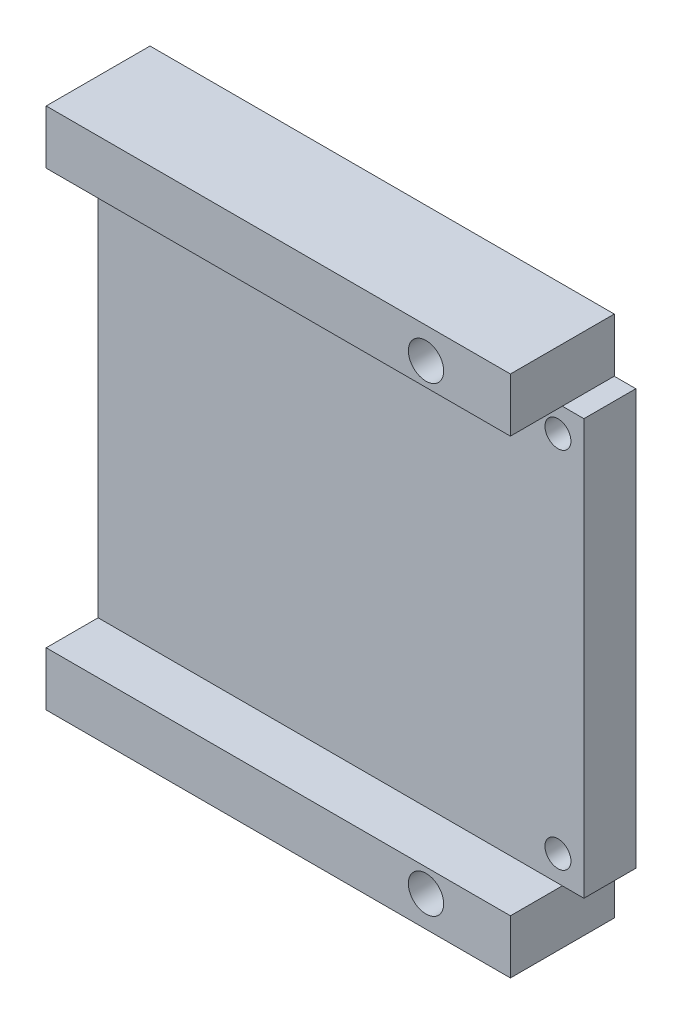
ISO-10303-21;
HEADER;
FILE_DESCRIPTION(('STEP AP214'),'2;1');
FILE_NAME('part.step','',(''),(''),'','','');
FILE_SCHEMA(('AUTOMOTIVE_DESIGN { 1 0 10303 214 1 1 1 1 }'));
ENDSEC;
DATA;
#1=APPLICATION_CONTEXT('core data for automotive mechanical design processes');
#2=APPLICATION_PROTOCOL_DEFINITION('international standard','automotive_design',2000,#1);
#3=PRODUCT_CONTEXT('',#1,'mechanical');
#4=PRODUCT('Part','Part','',(#3));
#5=PRODUCT_RELATED_PRODUCT_CATEGORY('part','',(#4));
#6=PRODUCT_DEFINITION_FORMATION('','',#4);
#7=PRODUCT_DEFINITION_CONTEXT('part definition',#1,'design');
#8=PRODUCT_DEFINITION('design','',#6,#7);
#9=PRODUCT_DEFINITION_SHAPE('','',#8);
#10=(LENGTH_UNIT() NAMED_UNIT(*) SI_UNIT(.MILLI.,.METRE.));
#11=(NAMED_UNIT(*) PLANE_ANGLE_UNIT() SI_UNIT($,.RADIAN.));
#12=(NAMED_UNIT(*) SI_UNIT($,.STERADIAN.) SOLID_ANGLE_UNIT());
#13=UNCERTAINTY_MEASURE_WITH_UNIT(LENGTH_MEASURE(1.E-05),#10,'distance_accuracy_value','');
#14=(GEOMETRIC_REPRESENTATION_CONTEXT(3) GLOBAL_UNCERTAINTY_ASSIGNED_CONTEXT((#13)) GLOBAL_UNIT_ASSIGNED_CONTEXT((#10,
#11,#12)) REPRESENTATION_CONTEXT('',''));
#15=CARTESIAN_POINT('',(0.,0.,0.));
#16=DIRECTION('',(0.,0.,1.));
#17=DIRECTION('',(1.,0.,0.));
#18=AXIS2_PLACEMENT_3D('',#15,#16,#17);
#19=CARTESIAN_POINT('',(0.,0.,5.));
#20=DIRECTION('',(0.,0.,-1.));
#21=DIRECTION('',(-1.,0.,0.));
#22=AXIS2_PLACEMENT_3D('',#19,#20,#21);
#23=PLANE('',#22);
#24=CARTESIAN_POINT('',(129.540225419175,91.2831739798293,5.));
#25=DIRECTION('',(0.,0.,1.));
#26=DIRECTION('',(1.,0.,0.));
#27=AXIS2_PLACEMENT_3D('',#24,#25,#26);
#28=CIRCLE('',#27,1.25000000000001);
#29=CARTESIAN_POINT('',(130.790225419175,91.2831739798293,5.));
#30=VERTEX_POINT('',#29);
#31=EDGE_CURVE('E203',#30,#30,#28,.T.);
#32=ORIENTED_EDGE('',*,*,#31,.F.);
#33=EDGE_LOOP('',(#32));
#34=FACE_BOUND('',#33,.T.);
#35=CARTESIAN_POINT('',(129.540225419175,56.2544582419486,5.));
#36=DIRECTION('',(0.,0.,1.));
#37=DIRECTION('',(1.,0.,0.));
#38=AXIS2_PLACEMENT_3D('',#35,#36,#37);
#39=CIRCLE('',#38,1.25032979393516);
#40=CARTESIAN_POINT('',(130.790555213111,56.2544582419486,5.));
#41=VERTEX_POINT('',#40);
#42=EDGE_CURVE('E195',#41,#41,#39,.T.);
#43=ORIENTED_EDGE('',*,*,#42,.F.);
#44=EDGE_LOOP('',(#43));
#45=FACE_BOUND('',#44,.T.);
#46=DIRECTION('',(-1.,0.,0.));
#47=VECTOR('',#46,1.);
#48=CARTESIAN_POINT('',(129.963224991925,53.7831739798293,5.));
#49=LINE('',#48,#47);
#50=CARTESIAN_POINT('',(129.963224991925,53.7831739798293,5.));
#51=VERTEX_POINT('',#50);
#52=CARTESIAN_POINT('',(85.253810187031,53.7831739798293,5.));
#53=VERTEX_POINT('',#52);
#54=EDGE_CURVE('E146',#51,#53,#49,.T.);
#55=ORIENTED_EDGE('',*,*,#54,.F.);
#56=DIRECTION('',(1.,0.,0.));
#57=VECTOR('',#56,1.);
#58=CARTESIAN_POINT('',(132.040225419175,53.7831739798293,5.));
#59=LINE('',#58,#57);
#60=CARTESIAN_POINT('',(132.040225419175,53.7831739798293,5.));
#61=VERTEX_POINT('',#60);
#62=EDGE_CURVE('E221',#51,#61,#59,.T.);
#63=ORIENTED_EDGE('',*,*,#62,.T.);
#64=DIRECTION('',(0.,1.,0.));
#65=VECTOR('',#64,1.);
#66=CARTESIAN_POINT('',(132.040225419175,93.7831739798293,5.));
#67=LINE('',#66,#65);
#68=CARTESIAN_POINT('',(132.040225419175,93.7831739798293,5.));
#69=VERTEX_POINT('',#68);
#70=EDGE_CURVE('E211',#61,#69,#67,.T.);
#71=ORIENTED_EDGE('',*,*,#70,.T.);
#72=DIRECTION('',(-0.999998956895983,0.00144437077845255,0.));
#73=VECTOR('',#72,1.);
#74=CARTESIAN_POINT('',(129.963224991925,93.7861739416825,5.));
#75=LINE('',#74,#73);
#76=CARTESIAN_POINT('',(129.963224991925,93.7861739416825,5.));
#77=VERTEX_POINT('',#76);
#78=EDGE_CURVE('E215',#69,#77,#75,.T.);
#79=ORIENTED_EDGE('',*,*,#78,.T.);
#80=DIRECTION('',(0.999999997748855,6.709910786271E-05,0.));
#81=VECTOR('',#80,1.);
#82=CARTESIAN_POINT('',(129.963224991925,93.7861739416825,5.));
#83=LINE('',#82,#81);
#84=CARTESIAN_POINT('',(85.253810187031,93.7831739798293,5.));
#85=VERTEX_POINT('',#84);
#86=EDGE_CURVE('E60',#85,#77,#83,.T.);
#87=ORIENTED_EDGE('',*,*,#86,.F.);
#88=DIRECTION('',(0.,-1.,0.));
#89=VECTOR('',#88,1.);
#90=CARTESIAN_POINT('',(85.253810187031,48.5941739798295,5.));
#91=LINE('',#90,#89);
#92=EDGE_CURVE('E55',#85,#53,#91,.T.);
#93=ORIENTED_EDGE('',*,*,#92,.T.);
#94=EDGE_LOOP('',(#55,#63,#71,#79,#87,#93));
#95=FACE_BOUND('',#94,.T.);
#96=ADVANCED_FACE('F39',(#34,#45,#95),#23,.F.);
#97=CARTESIAN_POINT('',(0.,0.,0.));
#98=DIRECTION('',(0.,0.,-1.));
#99=DIRECTION('',(-1.,0.,0.));
#100=AXIS2_PLACEMENT_3D('',#97,#98,#99);
#101=PLANE('',#100);
#102=CARTESIAN_POINT('',(121.835225419175,51.5641739798295,0.));
#103=DIRECTION('',(0.,0.,1.));
#104=DIRECTION('',(1.,0.,0.));
#105=AXIS2_PLACEMENT_3D('',#102,#103,#104);
#106=CIRCLE('',#105,1.70000000000001);
#107=CARTESIAN_POINT('',(123.535225419175,51.5641739798295,0.));
#108=VERTEX_POINT('',#107);
#109=EDGE_CURVE('E190',#108,#108,#106,.T.);
#110=ORIENTED_EDGE('',*,*,#109,.T.);
#111=EDGE_LOOP('',(#110));
#112=FACE_BOUND('',#111,.T.);
#113=CARTESIAN_POINT('',(129.540225419175,91.2831739798293,0.));
#114=DIRECTION('',(0.,0.,1.));
#115=DIRECTION('',(1.,0.,0.));
#116=AXIS2_PLACEMENT_3D('',#113,#114,#115);
#117=CIRCLE('',#116,1.25000000000001);
#118=CARTESIAN_POINT('',(130.790225419175,91.2831739798293,0.));
#119=VERTEX_POINT('',#118);
#120=EDGE_CURVE('E199',#119,#119,#117,.T.);
#121=ORIENTED_EDGE('',*,*,#120,.T.);
#122=EDGE_LOOP('',(#121));
#123=FACE_BOUND('',#122,.T.);
#124=DIRECTION('',(0.,1.,0.));
#125=VECTOR('',#124,1.);
#126=CARTESIAN_POINT('',(132.040225419175,93.7831739798293,0.));
#127=LINE('',#126,#125);
#128=CARTESIAN_POINT('',(132.040225419175,53.7831739798293,0.));
#129=VERTEX_POINT('',#128);
#130=CARTESIAN_POINT('',(132.040225419175,93.7831739798293,0.));
#131=VERTEX_POINT('',#130);
#132=EDGE_CURVE('E207',#129,#131,#127,.T.);
#133=ORIENTED_EDGE('',*,*,#132,.F.);
#134=DIRECTION('',(1.,0.,0.));
#135=VECTOR('',#134,1.);
#136=CARTESIAN_POINT('',(132.040225419175,53.7831739798293,0.));
#137=LINE('',#136,#135);
#138=CARTESIAN_POINT('',(129.963224991925,53.7831739798293,0.));
#139=VERTEX_POINT('',#138);
#140=EDGE_CURVE('E216',#139,#129,#137,.T.);
#141=ORIENTED_EDGE('',*,*,#140,.F.);
#142=DIRECTION('',(0.,1.,0.));
#143=VECTOR('',#142,1.);
#144=CARTESIAN_POINT('',(129.963224991925,53.7831739798293,0.));
#145=LINE('',#144,#143);
#146=CARTESIAN_POINT('',(129.963224991925,48.5941739798295,0.));
#147=VERTEX_POINT('',#146);
#148=EDGE_CURVE('E243',#147,#139,#145,.T.);
#149=ORIENTED_EDGE('',*,*,#148,.F.);
#150=DIRECTION('',(1.,0.,0.));
#151=VECTOR('',#150,1.);
#152=CARTESIAN_POINT('',(129.963224991925,48.5941739798295,0.));
#153=LINE('',#152,#151);
#154=CARTESIAN_POINT('',(85.253810187031,48.5941739798295,0.));
#155=VERTEX_POINT('',#154);
#156=EDGE_CURVE('E240',#155,#147,#153,.T.);
#157=ORIENTED_EDGE('',*,*,#156,.F.);
#158=DIRECTION('',(0.,-1.,0.));
#159=VECTOR('',#158,1.);
#160=CARTESIAN_POINT('',(85.253810187031,48.5941739798295,0.));
#161=LINE('',#160,#159);
#162=CARTESIAN_POINT('',(85.253810187031,98.9731739798295,0.));
#163=VERTEX_POINT('',#162);
#164=EDGE_CURVE('E237',#163,#155,#161,.T.);
#165=ORIENTED_EDGE('',*,*,#164,.F.);
#166=DIRECTION('',(-1.,0.,0.));
#167=VECTOR('',#166,1.);
#168=CARTESIAN_POINT('',(85.253810187031,98.9731739798295,0.));
#169=LINE('',#168,#167);
#170=CARTESIAN_POINT('',(129.963224991925,98.9731739798295,0.));
#171=VERTEX_POINT('',#170);
#172=EDGE_CURVE('E234',#171,#163,#169,.T.);
#173=ORIENTED_EDGE('',*,*,#172,.F.);
#174=DIRECTION('',(0.,1.,0.));
#175=VECTOR('',#174,1.);
#176=CARTESIAN_POINT('',(129.963224991925,98.9731739798295,0.));
#177=LINE('',#176,#175);
#178=CARTESIAN_POINT('',(129.963224991925,93.7861739416825,0.));
#179=VERTEX_POINT('',#178);
#180=EDGE_CURVE('E231',#179,#171,#177,.T.);
#181=ORIENTED_EDGE('',*,*,#180,.F.);
#182=DIRECTION('',(-0.999998956895983,0.00144437077845255,0.));
#183=VECTOR('',#182,1.);
#184=CARTESIAN_POINT('',(129.963224991925,93.7861739416825,0.));
#185=LINE('',#184,#183);
#186=EDGE_CURVE('E228',#131,#179,#185,.T.);
#187=ORIENTED_EDGE('',*,*,#186,.F.);
#188=EDGE_LOOP('',(#133,#141,#149,#157,#165,#173,#181,#187));
#189=FACE_BOUND('',#188,.T.);
#190=CARTESIAN_POINT('',(129.540225419175,56.2544582419486,0.));
#191=DIRECTION('',(0.,0.,1.));
#192=DIRECTION('',(1.,0.,0.));
#193=AXIS2_PLACEMENT_3D('',#190,#191,#192);
#194=CIRCLE('',#193,1.25032979393516);
#195=CARTESIAN_POINT('',(130.790555213111,56.2544582419486,0.));
#196=VERTEX_POINT('',#195);
#197=EDGE_CURVE('E194',#196,#196,#194,.T.);
#198=ORIENTED_EDGE('',*,*,#197,.T.);
#199=EDGE_LOOP('',(#198));
#200=FACE_BOUND('',#199,.T.);
#201=CARTESIAN_POINT('',(121.835225419175,96.0031739798295,0.));
#202=DIRECTION('',(0.,0.,1.));
#203=DIRECTION('',(1.,0.,0.));
#204=AXIS2_PLACEMENT_3D('',#201,#202,#203);
#205=CIRCLE('',#204,1.7);
#206=CARTESIAN_POINT('',(123.535225419175,96.0031739798295,0.));
#207=VERTEX_POINT('',#206);
#208=EDGE_CURVE('E186',#207,#207,#205,.T.);
#209=ORIENTED_EDGE('',*,*,#208,.T.);
#210=EDGE_LOOP('',(#209));
#211=FACE_BOUND('',#210,.T.);
#212=ADVANCED_FACE('F278',(#112,#123,#189,#200,#211),#101,.T.);
#213=CARTESIAN_POINT('',(132.040225419175,93.7831739798293,5.));
#214=DIRECTION('',(-1.,0.,0.));
#215=DIRECTION('',(0.,0.,1.));
#216=AXIS2_PLACEMENT_3D('',#213,#214,#215);
#217=PLANE('',#216);
#218=ORIENTED_EDGE('',*,*,#132,.T.);
#219=DIRECTION('',(0.,0.,-1.));
#220=VECTOR('',#219,1.);
#221=CARTESIAN_POINT('',(132.040225419175,93.7831739798293,5.));
#222=LINE('',#221,#220);
#223=EDGE_CURVE('E11',#69,#131,#222,.T.);
#224=ORIENTED_EDGE('',*,*,#223,.F.);
#225=ORIENTED_EDGE('',*,*,#70,.F.);
#226=DIRECTION('',(0.,0.,-1.));
#227=VECTOR('',#226,1.);
#228=CARTESIAN_POINT('',(132.040225419175,53.7831739798293,5.));
#229=LINE('',#228,#227);
#230=EDGE_CURVE('E224',#61,#129,#229,.T.);
#231=ORIENTED_EDGE('',*,*,#230,.T.);
#232=EDGE_LOOP('',(#218,#224,#225,#231));
#233=FACE_BOUND('',#232,.T.);
#234=ADVANCED_FACE('F41',(#233),#217,.F.);
#235=CARTESIAN_POINT('',(129.963224991925,93.7861739416825,5.));
#236=DIRECTION('',(-0.00144437077845255,-0.999998956895983,0.));
#237=DIRECTION('',(0.999998956895983,-0.00144437077845255,0.));
#238=AXIS2_PLACEMENT_3D('',#235,#236,#237);
#239=PLANE('',#238);
#240=ORIENTED_EDGE('',*,*,#186,.T.);
#241=DIRECTION('',(0.,0.,-1.));
#242=VECTOR('',#241,1.);
#243=CARTESIAN_POINT('',(129.963224991925,93.7861739416825,5.));
#244=LINE('',#243,#242);
#245=EDGE_CURVE('E48',#77,#179,#244,.T.);
#246=ORIENTED_EDGE('',*,*,#245,.F.);
#247=ORIENTED_EDGE('',*,*,#78,.F.);
#248=ORIENTED_EDGE('',*,*,#223,.T.);
#249=EDGE_LOOP('',(#240,#246,#247,#248));
#250=FACE_BOUND('',#249,.T.);
#251=ADVANCED_FACE('F334',(#250),#239,.F.);
#252=CARTESIAN_POINT('',(129.963224991925,98.9731739798295,5.));
#253=DIRECTION('',(-1.,0.,0.));
#254=DIRECTION('',(0.,0.,1.));
#255=AXIS2_PLACEMENT_3D('',#252,#253,#254);
#256=PLANE('',#255);
#257=ORIENTED_EDGE('',*,*,#180,.T.);
#258=DIRECTION('',(0.,0.,-1.));
#259=VECTOR('',#258,1.);
#260=CARTESIAN_POINT('',(129.963224991925,98.9731739798295,5.));
#261=LINE('',#260,#259);
#262=CARTESIAN_POINT('',(129.963224991925,98.9731739798295,10.));
#263=VERTEX_POINT('',#262);
#264=EDGE_CURVE('E264',#263,#171,#261,.T.);
#265=ORIENTED_EDGE('',*,*,#264,.F.);
#266=DIRECTION('',(0.,1.,0.));
#267=VECTOR('',#266,1.);
#268=CARTESIAN_POINT('',(129.963224991925,93.7861739416825,10.));
#269=LINE('',#268,#267);
#270=CARTESIAN_POINT('',(129.963224991925,93.7861739416825,10.));
#271=VERTEX_POINT('',#270);
#272=EDGE_CURVE('E162',#271,#263,#269,.T.);
#273=ORIENTED_EDGE('',*,*,#272,.F.);
#274=DIRECTION('',(0.,0.,-1.));
#275=VECTOR('',#274,1.);
#276=CARTESIAN_POINT('',(129.963224991925,93.7861739416825,10.));
#277=LINE('',#276,#275);
#278=EDGE_CURVE('E176',#271,#77,#277,.T.);
#279=ORIENTED_EDGE('',*,*,#278,.T.);
#280=ORIENTED_EDGE('',*,*,#245,.T.);
#281=EDGE_LOOP('',(#257,#265,#273,#279,#280));
#282=FACE_BOUND('',#281,.T.);
#283=ADVANCED_FACE('F271',(#282),#256,.F.);
#284=CARTESIAN_POINT('',(85.253810187031,98.9731739798295,5.));
#285=DIRECTION('',(0.,-1.,0.));
#286=DIRECTION('',(0.,0.,-1.));
#287=AXIS2_PLACEMENT_3D('',#284,#285,#286);
#288=PLANE('',#287);
#289=ORIENTED_EDGE('',*,*,#172,.T.);
#290=DIRECTION('',(0.,0.,-1.));
#291=VECTOR('',#290,1.);
#292=CARTESIAN_POINT('',(85.253810187031,98.9731739798295,5.));
#293=LINE('',#292,#291);
#294=CARTESIAN_POINT('',(85.253810187031,98.9731739798295,10.));
#295=VERTEX_POINT('',#294);
#296=EDGE_CURVE('E260',#295,#163,#293,.T.);
#297=ORIENTED_EDGE('',*,*,#296,.F.);
#298=DIRECTION('',(-1.,0.,0.));
#299=VECTOR('',#298,1.);
#300=CARTESIAN_POINT('',(129.963224991925,98.9731739798295,10.));
#301=LINE('',#300,#299);
#302=EDGE_CURVE('E166',#263,#295,#301,.T.);
#303=ORIENTED_EDGE('',*,*,#302,.F.);
#304=ORIENTED_EDGE('',*,*,#264,.T.);
#305=EDGE_LOOP('',(#289,#297,#303,#304));
#306=FACE_BOUND('',#305,.T.);
#307=ADVANCED_FACE('F283',(#306),#288,.F.);
#308=CARTESIAN_POINT('',(85.253810187031,48.5941739798295,5.));
#309=DIRECTION('',(1.,0.,0.));
#310=DIRECTION('',(0.,0.,-1.));
#311=AXIS2_PLACEMENT_3D('',#308,#309,#310);
#312=PLANE('',#311);
#313=ORIENTED_EDGE('',*,*,#164,.T.);
#314=DIRECTION('',(0.,0.,-1.));
#315=VECTOR('',#314,1.);
#316=CARTESIAN_POINT('',(85.253810187031,48.5941739798295,5.));
#317=LINE('',#316,#315);
#318=CARTESIAN_POINT('',(85.253810187031,48.5941739798295,10.));
#319=VERTEX_POINT('',#318);
#320=EDGE_CURVE('E256',#319,#155,#317,.T.);
#321=ORIENTED_EDGE('',*,*,#320,.F.);
#322=DIRECTION('',(0.,-1.,0.));
#323=VECTOR('',#322,1.);
#324=CARTESIAN_POINT('',(85.253810187031,53.7831739798293,10.));
#325=LINE('',#324,#323);
#326=CARTESIAN_POINT('',(85.253810187031,53.7831739798293,10.));
#327=VERTEX_POINT('',#326);
#328=EDGE_CURVE('E134',#327,#319,#325,.T.);
#329=ORIENTED_EDGE('',*,*,#328,.F.);
#330=DIRECTION('',(0.,0.,-1.));
#331=VECTOR('',#330,1.);
#332=CARTESIAN_POINT('',(85.253810187031,53.7831739798293,10.));
#333=LINE('',#332,#331);
#334=EDGE_CURVE('E129',#327,#53,#333,.T.);
#335=ORIENTED_EDGE('',*,*,#334,.T.);
#336=ORIENTED_EDGE('',*,*,#92,.F.);
#337=DIRECTION('',(0.,0.,-1.));
#338=VECTOR('',#337,1.);
#339=CARTESIAN_POINT('',(85.253810187031,93.7831739798293,10.));
#340=LINE('',#339,#338);
#341=CARTESIAN_POINT('',(85.253810187031,93.7831739798293,10.));
#342=VERTEX_POINT('',#341);
#343=EDGE_CURVE('E182',#342,#85,#340,.T.);
#344=ORIENTED_EDGE('',*,*,#343,.F.);
#345=DIRECTION('',(0.,-1.,0.));
#346=VECTOR('',#345,1.);
#347=CARTESIAN_POINT('',(85.253810187031,98.9731739798295,10.));
#348=LINE('',#347,#346);
#349=EDGE_CURVE('E170',#295,#342,#348,.T.);
#350=ORIENTED_EDGE('',*,*,#349,.F.);
#351=ORIENTED_EDGE('',*,*,#296,.T.);
#352=EDGE_LOOP('',(#313,#321,#329,#335,#336,#344,#350,#351));
#353=FACE_BOUND('',#352,.T.);
#354=ADVANCED_FACE('F287',(#353),#312,.F.);
#355=CARTESIAN_POINT('',(129.963224991925,48.5941739798295,5.));
#356=DIRECTION('',(0.,1.,0.));
#357=DIRECTION('',(0.,0.,1.));
#358=AXIS2_PLACEMENT_3D('',#355,#356,#357);
#359=PLANE('',#358);
#360=ORIENTED_EDGE('',*,*,#156,.T.);
#361=DIRECTION('',(0.,0.,-1.));
#362=VECTOR('',#361,1.);
#363=CARTESIAN_POINT('',(129.963224991925,48.5941739798295,5.));
#364=LINE('',#363,#362);
#365=CARTESIAN_POINT('',(129.963224991925,48.5941739798295,10.));
#366=VERTEX_POINT('',#365);
#367=EDGE_CURVE('E253',#366,#147,#364,.T.);
#368=ORIENTED_EDGE('',*,*,#367,.F.);
#369=DIRECTION('',(1.,0.,0.));
#370=VECTOR('',#369,1.);
#371=CARTESIAN_POINT('',(85.253810187031,48.5941739798295,10.));
#372=LINE('',#371,#370);
#373=EDGE_CURVE('E142',#319,#366,#372,.T.);
#374=ORIENTED_EDGE('',*,*,#373,.F.);
#375=ORIENTED_EDGE('',*,*,#320,.T.);
#376=EDGE_LOOP('',(#360,#368,#374,#375));
#377=FACE_BOUND('',#376,.T.);
#378=ADVANCED_FACE('F325',(#377),#359,.F.);
#379=CARTESIAN_POINT('',(129.963224991925,53.7831739798293,5.));
#380=DIRECTION('',(-1.,0.,0.));
#381=DIRECTION('',(0.,0.,1.));
#382=AXIS2_PLACEMENT_3D('',#379,#380,#381);
#383=PLANE('',#382);
#384=ORIENTED_EDGE('',*,*,#148,.T.);
#385=DIRECTION('',(0.,0.,-1.));
#386=VECTOR('',#385,1.);
#387=CARTESIAN_POINT('',(129.963224991925,53.7831739798293,5.));
#388=LINE('',#387,#386);
#389=EDGE_CURVE('E151',#51,#139,#388,.T.);
#390=ORIENTED_EDGE('',*,*,#389,.F.);
#391=DIRECTION('',(0.,0.,-1.));
#392=VECTOR('',#391,1.);
#393=CARTESIAN_POINT('',(129.963224991925,53.7831739798293,10.));
#394=LINE('',#393,#392);
#395=CARTESIAN_POINT('',(129.963224991925,53.7831739798293,10.));
#396=VERTEX_POINT('',#395);
#397=EDGE_CURVE('E127',#396,#51,#394,.T.);
#398=ORIENTED_EDGE('',*,*,#397,.F.);
#399=DIRECTION('',(0.,1.,0.));
#400=VECTOR('',#399,1.);
#401=CARTESIAN_POINT('',(129.963224991925,48.5941739798295,10.));
#402=LINE('',#401,#400);
#403=EDGE_CURVE('E135',#366,#396,#402,.T.);
#404=ORIENTED_EDGE('',*,*,#403,.F.);
#405=ORIENTED_EDGE('',*,*,#367,.T.);
#406=EDGE_LOOP('',(#384,#390,#398,#404,#405));
#407=FACE_BOUND('',#406,.T.);
#408=ADVANCED_FACE('F149',(#407),#383,.F.);
#409=CARTESIAN_POINT('',(132.040225419175,53.7831739798293,5.));
#410=DIRECTION('',(0.,1.,0.));
#411=DIRECTION('',(0.,0.,1.));
#412=AXIS2_PLACEMENT_3D('',#409,#410,#411);
#413=PLANE('',#412);
#414=ORIENTED_EDGE('',*,*,#140,.T.);
#415=ORIENTED_EDGE('',*,*,#230,.F.);
#416=ORIENTED_EDGE('',*,*,#62,.F.);
#417=ORIENTED_EDGE('',*,*,#389,.T.);
#418=EDGE_LOOP('',(#414,#415,#416,#417));
#419=FACE_BOUND('',#418,.T.);
#420=ADVANCED_FACE('F319',(#419),#413,.F.);
#421=CARTESIAN_POINT('',(129.540225419175,91.2831739798293,5.));
#422=DIRECTION('',(0.,0.,-1.));
#423=DIRECTION('',(-1.,0.,0.));
#424=AXIS2_PLACEMENT_3D('',#421,#422,#423);
#425=CYLINDRICAL_SURFACE('',#424,1.25000000000001);
#426=ORIENTED_EDGE('',*,*,#31,.T.);
#427=EDGE_LOOP('',(#426));
#428=FACE_BOUND('',#427,.T.);
#429=ORIENTED_EDGE('',*,*,#120,.F.);
#430=EDGE_LOOP('',(#429));
#431=FACE_BOUND('',#430,.T.);
#432=ADVANCED_FACE('F316',(#428,#431),#425,.F.);
#433=CARTESIAN_POINT('',(129.540225419175,56.2544582419486,5.));
#434=DIRECTION('',(0.,0.,-1.));
#435=DIRECTION('',(-1.,0.,0.));
#436=AXIS2_PLACEMENT_3D('',#433,#434,#435);
#437=CYLINDRICAL_SURFACE('',#436,1.25032979393516);
#438=ORIENTED_EDGE('',*,*,#42,.T.);
#439=EDGE_LOOP('',(#438));
#440=FACE_BOUND('',#439,.T.);
#441=ORIENTED_EDGE('',*,*,#197,.F.);
#442=EDGE_LOOP('',(#441));
#443=FACE_BOUND('',#442,.T.);
#444=ADVANCED_FACE('F358',(#440,#443),#437,.F.);
#445=CARTESIAN_POINT('',(121.835225419175,51.5641739798295,5.));
#446=DIRECTION('',(0.,0.,-1.));
#447=DIRECTION('',(-1.,0.,0.));
#448=AXIS2_PLACEMENT_3D('',#445,#446,#447);
#449=CYLINDRICAL_SURFACE('',#448,1.70000000000001);
#450=ORIENTED_EDGE('',*,*,#109,.F.);
#451=EDGE_LOOP('',(#450));
#452=FACE_BOUND('',#451,.T.);
#453=CARTESIAN_POINT('',(121.835225419175,51.5641739798295,10.));
#454=DIRECTION('',(0.,0.,1.));
#455=DIRECTION('',(1.,0.,0.));
#456=AXIS2_PLACEMENT_3D('',#453,#454,#455);
#457=CIRCLE('',#456,1.7);
#458=CARTESIAN_POINT('',(123.535225419175,51.5641739798295,10.));
#459=VERTEX_POINT('',#458);
#460=EDGE_CURVE('E346',#459,#459,#457,.T.);
#461=ORIENTED_EDGE('',*,*,#460,.T.);
#462=EDGE_LOOP('',(#461));
#463=FACE_BOUND('',#462,.T.);
#464=ADVANCED_FACE('F356',(#452,#463),#449,.F.);
#465=CARTESIAN_POINT('',(121.835225419175,96.0031739798295,5.));
#466=DIRECTION('',(0.,0.,-1.));
#467=DIRECTION('',(-1.,0.,0.));
#468=AXIS2_PLACEMENT_3D('',#465,#466,#467);
#469=CYLINDRICAL_SURFACE('',#468,1.7);
#470=ORIENTED_EDGE('',*,*,#208,.F.);
#471=EDGE_LOOP('',(#470));
#472=FACE_BOUND('',#471,.T.);
#473=CARTESIAN_POINT('',(121.835225419175,96.0031739798295,10.));
#474=DIRECTION('',(0.,0.,1.));
#475=DIRECTION('',(1.,0.,0.));
#476=AXIS2_PLACEMENT_3D('',#473,#474,#475);
#477=CIRCLE('',#476,1.7);
#478=CARTESIAN_POINT('',(123.535225419175,96.0031739798295,10.));
#479=VERTEX_POINT('',#478);
#480=EDGE_CURVE('E153',#479,#479,#477,.T.);
#481=ORIENTED_EDGE('',*,*,#480,.T.);
#482=EDGE_LOOP('',(#481));
#483=FACE_BOUND('',#482,.T.);
#484=ADVANCED_FACE('F302',(#472,#483),#469,.F.);
#485=CARTESIAN_POINT('',(0.,0.,10.));
#486=DIRECTION('',(0.,0.,1.));
#487=DIRECTION('',(1.,0.,0.));
#488=AXIS2_PLACEMENT_3D('',#485,#486,#487);
#489=PLANE('',#488);
#490=ORIENTED_EDGE('',*,*,#272,.T.);
#491=ORIENTED_EDGE('',*,*,#302,.T.);
#492=ORIENTED_EDGE('',*,*,#349,.T.);
#493=DIRECTION('',(0.999999997748855,6.709910786271E-05,0.));
#494=VECTOR('',#493,1.);
#495=CARTESIAN_POINT('',(129.963224991925,93.7861739416825,10.));
#496=LINE('',#495,#494);
#497=EDGE_CURVE('E173',#342,#271,#496,.T.);
#498=ORIENTED_EDGE('',*,*,#497,.T.);
#499=EDGE_LOOP('',(#490,#491,#492,#498));
#500=FACE_BOUND('',#499,.T.);
#501=ORIENTED_EDGE('',*,*,#480,.F.);
#502=EDGE_LOOP('',(#501));
#503=FACE_BOUND('',#502,.T.);
#504=ADVANCED_FACE('F291',(#500,#503),#489,.T.);
#505=CARTESIAN_POINT('',(129.963224991925,93.7861739416825,10.));
#506=DIRECTION('',(-6.709910786271E-05,0.999999997748855,0.));
#507=DIRECTION('',(-0.999999997748855,-6.709910786271E-05,0.));
#508=AXIS2_PLACEMENT_3D('',#505,#506,#507);
#509=PLANE('',#508);
#510=ORIENTED_EDGE('',*,*,#86,.T.);
#511=ORIENTED_EDGE('',*,*,#278,.F.);
#512=ORIENTED_EDGE('',*,*,#497,.F.);
#513=ORIENTED_EDGE('',*,*,#343,.T.);
#514=EDGE_LOOP('',(#510,#511,#512,#513));
#515=FACE_BOUND('',#514,.T.);
#516=ADVANCED_FACE('F294',(#515),#509,.F.);
#517=CARTESIAN_POINT('',(0.,0.,10.));
#518=DIRECTION('',(0.,0.,1.));
#519=DIRECTION('',(1.,0.,0.));
#520=AXIS2_PLACEMENT_3D('',#517,#518,#519);
#521=PLANE('',#520);
#522=ORIENTED_EDGE('',*,*,#403,.T.);
#523=DIRECTION('',(-1.,0.,0.));
#524=VECTOR('',#523,1.);
#525=CARTESIAN_POINT('',(129.963224991925,53.7831739798293,10.));
#526=LINE('',#525,#524);
#527=EDGE_CURVE('E123',#396,#327,#526,.T.);
#528=ORIENTED_EDGE('',*,*,#527,.T.);
#529=ORIENTED_EDGE('',*,*,#328,.T.);
#530=ORIENTED_EDGE('',*,*,#373,.T.);
#531=EDGE_LOOP('',(#522,#528,#529,#530));
#532=FACE_BOUND('',#531,.T.);
#533=ORIENTED_EDGE('',*,*,#460,.F.);
#534=EDGE_LOOP('',(#533));
#535=FACE_BOUND('',#534,.T.);
#536=ADVANCED_FACE('F139',(#532,#535),#521,.T.);
#537=CARTESIAN_POINT('',(129.963224991925,53.7831739798293,10.));
#538=DIRECTION('',(0.,-1.,0.));
#539=DIRECTION('',(0.,0.,-1.));
#540=AXIS2_PLACEMENT_3D('',#537,#538,#539);
#541=PLANE('',#540);
#542=ORIENTED_EDGE('',*,*,#54,.T.);
#543=ORIENTED_EDGE('',*,*,#334,.F.);
#544=ORIENTED_EDGE('',*,*,#527,.F.);
#545=ORIENTED_EDGE('',*,*,#397,.T.);
#546=EDGE_LOOP('',(#542,#543,#544,#545));
#547=FACE_BOUND('',#546,.T.);
#548=ADVANCED_FACE('F125',(#547),#541,.F.);
#549=CLOSED_SHELL('',(#96,#212,#234,#251,#283,#307,#354,#378,#408,#420,#432,#444,#464,#484,#504,
#516,#536,#548));
#550=MANIFOLD_SOLID_BREP('B2',#549);
#551=ADVANCED_BREP_SHAPE_REPRESENTATION('',(#18,#550),#14);
#552=SHAPE_DEFINITION_REPRESENTATION(#9,#551);
ENDSEC;
END-ISO-10303-21;
